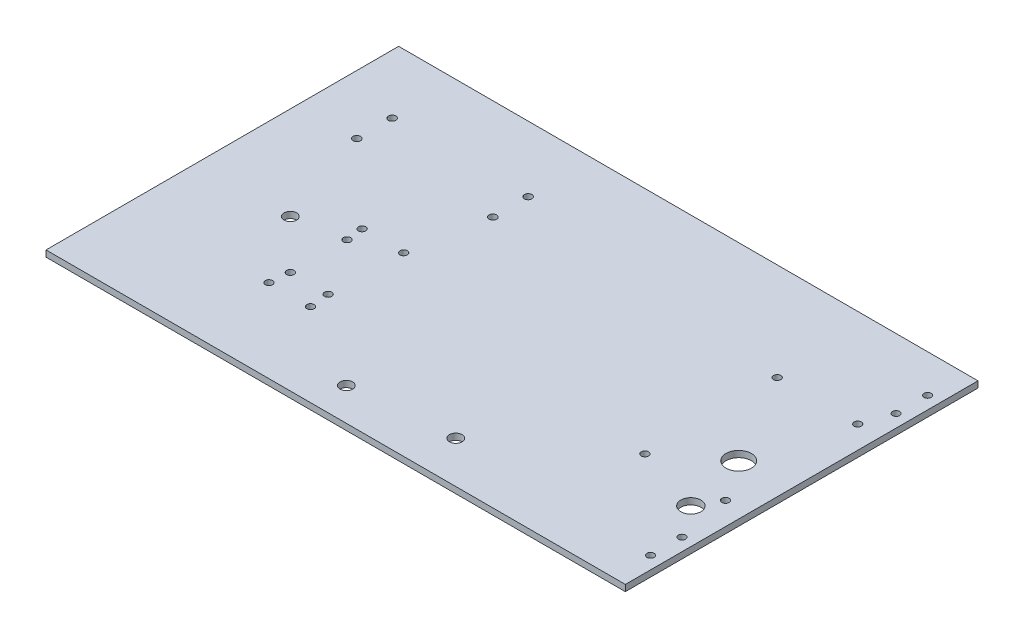
ISO-10303-21;
HEADER;
FILE_DESCRIPTION(('STEP AP214'),'2;1');
FILE_NAME('part.step','',(''),(''),'','','');
FILE_SCHEMA(('AUTOMOTIVE_DESIGN { 1 0 10303 214 1 1 1 1 }'));
ENDSEC;
DATA;
#1=APPLICATION_CONTEXT('core data for automotive mechanical design processes');
#2=APPLICATION_PROTOCOL_DEFINITION('international standard','automotive_design',2000,#1);
#3=PRODUCT_CONTEXT('',#1,'mechanical');
#4=PRODUCT('Part','Part','',(#3));
#5=PRODUCT_RELATED_PRODUCT_CATEGORY('part','',(#4));
#6=PRODUCT_DEFINITION_FORMATION('','',#4);
#7=PRODUCT_DEFINITION_CONTEXT('part definition',#1,'design');
#8=PRODUCT_DEFINITION('design','',#6,#7);
#9=PRODUCT_DEFINITION_SHAPE('','',#8);
#10=(LENGTH_UNIT() NAMED_UNIT(*) SI_UNIT(.MILLI.,.METRE.));
#11=(NAMED_UNIT(*) PLANE_ANGLE_UNIT() SI_UNIT($,.RADIAN.));
#12=(NAMED_UNIT(*) SI_UNIT($,.STERADIAN.) SOLID_ANGLE_UNIT());
#13=UNCERTAINTY_MEASURE_WITH_UNIT(LENGTH_MEASURE(1.E-05),#10,'distance_accuracy_value','');
#14=(GEOMETRIC_REPRESENTATION_CONTEXT(3) GLOBAL_UNCERTAINTY_ASSIGNED_CONTEXT((#13)) GLOBAL_UNIT_ASSIGNED_CONTEXT((#10,
#11,#12)) REPRESENTATION_CONTEXT('',''));
#15=CARTESIAN_POINT('',(0.,0.,0.));
#16=DIRECTION('',(0.,0.,1.));
#17=DIRECTION('',(1.,0.,0.));
#18=AXIS2_PLACEMENT_3D('',#15,#16,#17);
#19=CARTESIAN_POINT('',(0.,3.175,0.));
#20=DIRECTION('',(0.,1.,0.));
#21=DIRECTION('',(0.,0.,1.));
#22=AXIS2_PLACEMENT_3D('',#19,#20,#21);
#23=PLANE('',#22);
#24=CARTESIAN_POINT('',(-87.3125,3.175,37.1475));
#25=DIRECTION('',(0.,1.,0.));
#26=DIRECTION('',(0.,0.,1.));
#27=AXIS2_PLACEMENT_3D('',#24,#25,#26);
#28=CIRCLE('',#27,1.8415);
#29=CARTESIAN_POINT('',(-87.3125,3.175,38.989));
#30=VERTEX_POINT('',#29);
#31=EDGE_CURVE('E207',#30,#30,#28,.T.);
#32=ORIENTED_EDGE('',*,*,#31,.F.);
#33=EDGE_LOOP('',(#32));
#34=FACE_BOUND('',#33,.T.);
#35=CARTESIAN_POINT('',(-88.2649999999999,3.175,46.99));
#36=DIRECTION('',(0.,1.,0.));
#37=DIRECTION('',(0.,0.,1.));
#38=AXIS2_PLACEMENT_3D('',#35,#36,#37);
#39=CIRCLE('',#38,1.84149999999999);
#40=CARTESIAN_POINT('',(-88.2649999999999,3.175,48.8315));
#41=VERTEX_POINT('',#40);
#42=EDGE_CURVE('E218',#41,#41,#39,.T.);
#43=ORIENTED_EDGE('',*,*,#42,.F.);
#44=EDGE_LOOP('',(#43));
#45=FACE_BOUND('',#44,.T.);
#46=CARTESIAN_POINT('',(-68.2625,3.175,37.1475));
#47=DIRECTION('',(0.,1.,0.));
#48=DIRECTION('',(0.,0.,1.));
#49=AXIS2_PLACEMENT_3D('',#46,#47,#48);
#50=CIRCLE('',#49,1.84150000000001);
#51=CARTESIAN_POINT('',(-68.2625,3.175,38.989));
#52=VERTEX_POINT('',#51);
#53=EDGE_CURVE('E219',#52,#52,#50,.T.);
#54=ORIENTED_EDGE('',*,*,#53,.F.);
#55=EDGE_LOOP('',(#54));
#56=FACE_BOUND('',#55,.T.);
#57=CARTESIAN_POINT('',(-87.3125,3.175,8.57250000000002));
#58=DIRECTION('',(0.,1.,0.));
#59=DIRECTION('',(0.,0.,1.));
#60=AXIS2_PLACEMENT_3D('',#57,#58,#59);
#61=CIRCLE('',#60,1.84150000000001);
#62=CARTESIAN_POINT('',(-87.3125,3.175,10.414));
#63=VERTEX_POINT('',#62);
#64=EDGE_CURVE('E230',#63,#63,#61,.T.);
#65=ORIENTED_EDGE('',*,*,#64,.F.);
#66=EDGE_LOOP('',(#65));
#67=FACE_BOUND('',#66,.T.);
#68=CARTESIAN_POINT('',(81.2800000000002,3.175,-39.6875));
#69=DIRECTION('',(0.,1.,0.));
#70=DIRECTION('',(0.,0.,1.));
#71=AXIS2_PLACEMENT_3D('',#68,#69,#70);
#72=CIRCLE('',#71,1.84150000000004);
#73=CARTESIAN_POINT('',(81.2800000000002,3.175,-37.8459999999999));
#74=VERTEX_POINT('',#73);
#75=EDGE_CURVE('E188',#74,#74,#72,.T.);
#76=ORIENTED_EDGE('',*,*,#75,.F.);
#77=EDGE_LOOP('',(#76));
#78=FACE_BOUND('',#77,.T.);
#79=CARTESIAN_POINT('',(81.2800000000001,3.175,26.9875));
#80=DIRECTION('',(0.,1.,0.));
#81=DIRECTION('',(0.,0.,1.));
#82=AXIS2_PLACEMENT_3D('',#79,#80,#81);
#83=CIRCLE('',#82,1.84149999999996);
#84=CARTESIAN_POINT('',(81.2800000000001,3.175,28.829));
#85=VERTEX_POINT('',#84);
#86=EDGE_CURVE('E194',#85,#85,#83,.T.);
#87=ORIENTED_EDGE('',*,*,#86,.F.);
#88=EDGE_LOOP('',(#87));
#89=FACE_BOUND('',#88,.T.);
#90=CARTESIAN_POINT('',(121.92,3.175,26.9875));
#91=DIRECTION('',(0.,1.,0.));
#92=DIRECTION('',(0.,0.,1.));
#93=AXIS2_PLACEMENT_3D('',#90,#91,#92);
#94=CIRCLE('',#93,1.8415);
#95=CARTESIAN_POINT('',(121.92,3.175,28.829));
#96=VERTEX_POINT('',#95);
#97=EDGE_CURVE('E195',#96,#96,#94,.T.);
#98=ORIENTED_EDGE('',*,*,#97,.F.);
#99=EDGE_LOOP('',(#98));
#100=FACE_BOUND('',#99,.T.);
#101=CARTESIAN_POINT('',(-67.3099999999999,3.175,46.99));
#102=DIRECTION('',(0.,1.,0.));
#103=DIRECTION('',(0.,0.,1.));
#104=AXIS2_PLACEMENT_3D('',#101,#102,#103);
#105=CIRCLE('',#104,1.8415);
#106=CARTESIAN_POINT('',(-67.3099999999999,3.175,48.8315));
#107=VERTEX_POINT('',#106);
#108=EDGE_CURVE('E206',#107,#107,#105,.T.);
#109=ORIENTED_EDGE('',*,*,#108,.F.);
#110=EDGE_LOOP('',(#109));
#111=FACE_BOUND('',#110,.T.);
#112=CARTESIAN_POINT('',(-88.2649999999999,3.175,0.));
#113=DIRECTION('',(0.,1.,0.));
#114=DIRECTION('',(0.,0.,1.));
#115=AXIS2_PLACEMENT_3D('',#112,#113,#114);
#116=CIRCLE('',#115,1.8415);
#117=CARTESIAN_POINT('',(-88.2649999999999,3.175,1.84150000000001));
#118=VERTEX_POINT('',#117);
#119=EDGE_CURVE('E231',#118,#118,#116,.T.);
#120=ORIENTED_EDGE('',*,*,#119,.F.);
#121=EDGE_LOOP('',(#120));
#122=FACE_BOUND('',#121,.T.);
#123=CARTESIAN_POINT('',(-67.3099999999999,3.175,0.));
#124=DIRECTION('',(0.,1.,0.));
#125=DIRECTION('',(0.,0.,1.));
#126=AXIS2_PLACEMENT_3D('',#123,#124,#125);
#127=CIRCLE('',#126,1.8415);
#128=CARTESIAN_POINT('',(-67.3099999999999,3.175,1.84150000000001));
#129=VERTEX_POINT('',#128);
#130=EDGE_CURVE('E242',#129,#129,#127,.T.);
#131=ORIENTED_EDGE('',*,*,#130,.F.);
#132=EDGE_LOOP('',(#131));
#133=FACE_BOUND('',#132,.T.);
#134=CARTESIAN_POINT('',(121.92,3.175,-39.6875));
#135=DIRECTION('',(0.,1.,0.));
#136=DIRECTION('',(0.,0.,1.));
#137=AXIS2_PLACEMENT_3D('',#134,#135,#136);
#138=CIRCLE('',#137,1.8415);
#139=CARTESIAN_POINT('',(121.92,3.175,-37.846));
#140=VERTEX_POINT('',#139);
#141=EDGE_CURVE('E185',#140,#140,#138,.T.);
#142=ORIENTED_EDGE('',*,*,#141,.F.);
#143=EDGE_LOOP('',(#142));
#144=FACE_BOUND('',#143,.T.);
#145=CARTESIAN_POINT('',(127.,3.175,69.85));
#146=DIRECTION('',(0.,-1.,0.));
#147=DIRECTION('',(0.,0.,-1.));
#148=AXIS2_PLACEMENT_3D('',#145,#146,#147);
#149=CIRCLE('',#148,1.80340000000001);
#150=CARTESIAN_POINT('',(127.,3.175,68.0466));
#151=VERTEX_POINT('',#150);
#152=EDGE_CURVE('E158',#151,#151,#149,.T.);
#153=ORIENTED_EDGE('',*,*,#152,.T.);
#154=EDGE_LOOP('',(#153));
#155=FACE_BOUND('',#154,.T.);
#156=CARTESIAN_POINT('',(127.,3.175,53.975));
#157=DIRECTION('',(0.,-1.,0.));
#158=DIRECTION('',(0.,0.,-1.));
#159=AXIS2_PLACEMENT_3D('',#156,#157,#158);
#160=CIRCLE('',#159,1.80340000000001);
#161=CARTESIAN_POINT('',(127.,3.175,52.1716));
#162=VERTEX_POINT('',#161);
#163=EDGE_CURVE('E174',#162,#162,#160,.T.);
#164=ORIENTED_EDGE('',*,*,#163,.T.);
#165=EDGE_LOOP('',(#164));
#166=FACE_BOUND('',#165,.T.);
#167=CARTESIAN_POINT('',(127.,3.175,-53.975));
#168=DIRECTION('',(0.,-1.,0.));
#169=DIRECTION('',(0.,0.,-1.));
#170=AXIS2_PLACEMENT_3D('',#167,#168,#169);
#171=CIRCLE('',#170,1.80340000000001);
#172=CARTESIAN_POINT('',(127.,3.175,-55.7784));
#173=VERTEX_POINT('',#172);
#174=EDGE_CURVE('E168',#173,#173,#171,.T.);
#175=ORIENTED_EDGE('',*,*,#174,.T.);
#176=EDGE_LOOP('',(#175));
#177=FACE_BOUND('',#176,.T.);
#178=CARTESIAN_POINT('',(127.,3.175,-69.85));
#179=DIRECTION('',(0.,-1.,0.));
#180=DIRECTION('',(0.,0.,-1.));
#181=AXIS2_PLACEMENT_3D('',#178,#179,#180);
#182=CIRCLE('',#181,1.80340000000001);
#183=CARTESIAN_POINT('',(127.,3.175,-71.6534));
#184=VERTEX_POINT('',#183);
#185=EDGE_CURVE('E161',#184,#184,#182,.T.);
#186=ORIENTED_EDGE('',*,*,#185,.T.);
#187=EDGE_LOOP('',(#186));
#188=FACE_BOUND('',#187,.T.);
#189=CARTESIAN_POINT('',(115.57,3.175,38.1));
#190=DIRECTION('',(0.,1.,0.));
#191=DIRECTION('',(0.,0.,1.));
#192=AXIS2_PLACEMENT_3D('',#189,#190,#191);
#193=CIRCLE('',#192,5.08000000000001);
#194=CARTESIAN_POINT('',(115.57,3.175,43.18));
#195=VERTEX_POINT('',#194);
#196=EDGE_CURVE('E155',#195,#195,#193,.T.);
#197=ORIENTED_EDGE('',*,*,#196,.F.);
#198=EDGE_LOOP('',(#197));
#199=FACE_BOUND('',#198,.T.);
#200=DIRECTION('',(0.,0.,1.));
#201=VECTOR('',#200,1.);
#202=CARTESIAN_POINT('',(133.35,3.175,-88.9));
#203=LINE('',#202,#201);
#204=CARTESIAN_POINT('',(133.35,3.175,-88.9));
#205=VERTEX_POINT('',#204);
#206=CARTESIAN_POINT('',(133.35,3.175,88.9));
#207=VERTEX_POINT('',#206);
#208=EDGE_CURVE('E52',#205,#207,#203,.T.);
#209=ORIENTED_EDGE('',*,*,#208,.F.);
#210=DIRECTION('',(-1.,0.,0.));
#211=VECTOR('',#210,1.);
#212=CARTESIAN_POINT('',(-158.75,3.175,-88.9));
#213=LINE('',#212,#211);
#214=CARTESIAN_POINT('',(-158.75,3.175,-88.9));
#215=VERTEX_POINT('',#214);
#216=EDGE_CURVE('E93',#205,#215,#213,.T.);
#217=ORIENTED_EDGE('',*,*,#216,.T.);
#218=DIRECTION('',(0.,0.,1.));
#219=VECTOR('',#218,1.);
#220=CARTESIAN_POINT('',(-158.75,3.175,-88.9));
#221=LINE('',#220,#219);
#222=CARTESIAN_POINT('',(-158.75,3.175,88.9));
#223=VERTEX_POINT('',#222);
#224=EDGE_CURVE('E61',#215,#223,#221,.T.);
#225=ORIENTED_EDGE('',*,*,#224,.T.);
#226=DIRECTION('',(1.,0.,0.));
#227=VECTOR('',#226,1.);
#228=CARTESIAN_POINT('',(-158.75,3.175,88.9));
#229=LINE('',#228,#227);
#230=EDGE_CURVE('E87',#223,#207,#229,.T.);
#231=ORIENTED_EDGE('',*,*,#230,.T.);
#232=EDGE_LOOP('',(#209,#217,#225,#231));
#233=FACE_BOUND('',#232,.T.);
#234=CARTESIAN_POINT('',(-23.829539608584,3.175,72.39));
#235=DIRECTION('',(0.,-1.,0.));
#236=DIRECTION('',(0.,0.,-1.));
#237=AXIS2_PLACEMENT_3D('',#234,#235,#236);
#238=CIRCLE('',#237,3.175);
#239=CARTESIAN_POINT('',(-23.829539608584,3.175,69.215));
#240=VERTEX_POINT('',#239);
#241=EDGE_CURVE('E134',#240,#240,#238,.T.);
#242=ORIENTED_EDGE('',*,*,#241,.T.);
#243=EDGE_LOOP('',(#242));
#244=FACE_BOUND('',#243,.T.);
#245=CARTESIAN_POINT('',(26.764302072,3.175,67.818));
#246=DIRECTION('',(0.,-1.,0.));
#247=DIRECTION('',(0.,0.,-1.));
#248=AXIS2_PLACEMENT_3D('',#245,#246,#247);
#249=CIRCLE('',#248,3.175);
#250=CARTESIAN_POINT('',(26.764302072,3.175,64.643));
#251=VERTEX_POINT('',#250);
#252=EDGE_CURVE('E140',#251,#251,#249,.T.);
#253=ORIENTED_EDGE('',*,*,#252,.T.);
#254=EDGE_LOOP('',(#253));
#255=FACE_BOUND('',#254,.T.);
#256=CARTESIAN_POINT('',(-129.032,3.175,-38.1));
#257=DIRECTION('',(0.,1.,0.));
#258=DIRECTION('',(0.,0.,1.));
#259=AXIS2_PLACEMENT_3D('',#256,#257,#258);
#260=CIRCLE('',#259,1.90499999999999);
#261=CARTESIAN_POINT('',(-129.032,3.175,-36.195));
#262=VERTEX_POINT('',#261);
#263=EDGE_CURVE('E122',#262,#262,#260,.T.);
#264=ORIENTED_EDGE('',*,*,#263,.F.);
#265=EDGE_LOOP('',(#264));
#266=FACE_BOUND('',#265,.T.);
#267=CARTESIAN_POINT('',(-129.032,3.175,-55.88));
#268=DIRECTION('',(0.,1.,0.));
#269=DIRECTION('',(0.,0.,1.));
#270=AXIS2_PLACEMENT_3D('',#267,#268,#269);
#271=CIRCLE('',#270,1.90499999999999);
#272=CARTESIAN_POINT('',(-129.032,3.175,-53.975));
#273=VERTEX_POINT('',#272);
#274=EDGE_CURVE('E110',#273,#273,#271,.T.);
#275=ORIENTED_EDGE('',*,*,#274,.F.);
#276=EDGE_LOOP('',(#275));
#277=FACE_BOUND('',#276,.T.);
#278=CARTESIAN_POINT('',(-111.76,3.175,12.7));
#279=DIRECTION('',(0.,1.,0.));
#280=DIRECTION('',(0.,0.,1.));
#281=AXIS2_PLACEMENT_3D('',#278,#279,#280);
#282=CIRCLE('',#281,3.175);
#283=CARTESIAN_POINT('',(-111.76,3.175,15.875));
#284=VERTEX_POINT('',#283);
#285=EDGE_CURVE('E98',#284,#284,#282,.T.);
#286=ORIENTED_EDGE('',*,*,#285,.F.);
#287=EDGE_LOOP('',(#286));
#288=FACE_BOUND('',#287,.T.);
#289=CARTESIAN_POINT('',(107.95,3.175,6.35000000000002));
#290=DIRECTION('',(0.,1.,0.));
#291=DIRECTION('',(0.,0.,1.));
#292=AXIS2_PLACEMENT_3D('',#289,#290,#291);
#293=CIRCLE('',#292,6.4135);
#294=CARTESIAN_POINT('',(107.95,3.175,12.7635));
#295=VERTEX_POINT('',#294);
#296=EDGE_CURVE('E104',#295,#295,#293,.T.);
#297=ORIENTED_EDGE('',*,*,#296,.F.);
#298=EDGE_LOOP('',(#297));
#299=FACE_BOUND('',#298,.T.);
#300=CARTESIAN_POINT('',(-60.452,3.175,-55.88));
#301=DIRECTION('',(0.,1.,0.));
#302=DIRECTION('',(0.,0.,1.));
#303=AXIS2_PLACEMENT_3D('',#300,#301,#302);
#304=CIRCLE('',#303,1.90500000000001);
#305=CARTESIAN_POINT('',(-60.452,3.175,-53.975));
#306=VERTEX_POINT('',#305);
#307=EDGE_CURVE('E116',#306,#306,#304,.T.);
#308=ORIENTED_EDGE('',*,*,#307,.F.);
#309=EDGE_LOOP('',(#308));
#310=FACE_BOUND('',#309,.T.);
#311=CARTESIAN_POINT('',(-60.452,3.175,-38.1));
#312=DIRECTION('',(0.,1.,0.));
#313=DIRECTION('',(0.,0.,1.));
#314=AXIS2_PLACEMENT_3D('',#311,#312,#313);
#315=CIRCLE('',#314,1.90500000000001);
#316=CARTESIAN_POINT('',(-60.452,3.175,-36.195));
#317=VERTEX_POINT('',#316);
#318=EDGE_CURVE('E128',#317,#317,#315,.T.);
#319=ORIENTED_EDGE('',*,*,#318,.F.);
#320=EDGE_LOOP('',(#319));
#321=FACE_BOUND('',#320,.T.);
#322=ADVANCED_FACE('F37',(#34,#45,#56,#67,#78,#89,#100,#111,#122,#133,#144,#155,#166,#177,#188,
#199,#233,#244,#255,#266,#277,#288,#299,#310,#321),#23,.T.);
#323=CARTESIAN_POINT('',(0.,0.,0.));
#324=DIRECTION('',(0.,1.,0.));
#325=DIRECTION('',(0.,0.,1.));
#326=AXIS2_PLACEMENT_3D('',#323,#324,#325);
#327=PLANE('',#326);
#328=CARTESIAN_POINT('',(-87.3125,0.,37.1475));
#329=DIRECTION('',(0.,1.,0.));
#330=DIRECTION('',(0.,0.,1.));
#331=AXIS2_PLACEMENT_3D('',#328,#329,#330);
#332=CIRCLE('',#331,1.8415);
#333=CARTESIAN_POINT('',(-87.3125,0.,38.989));
#334=VERTEX_POINT('',#333);
#335=EDGE_CURVE('E222',#334,#334,#332,.T.);
#336=ORIENTED_EDGE('',*,*,#335,.T.);
#337=EDGE_LOOP('',(#336));
#338=FACE_BOUND('',#337,.T.);
#339=CARTESIAN_POINT('',(-88.2649999999999,0.,46.99));
#340=DIRECTION('',(0.,1.,0.));
#341=DIRECTION('',(0.,0.,1.));
#342=AXIS2_PLACEMENT_3D('',#339,#340,#341);
#343=CIRCLE('',#342,1.84149999999999);
#344=CARTESIAN_POINT('',(-88.2649999999999,0.,48.8315));
#345=VERTEX_POINT('',#344);
#346=EDGE_CURVE('E215',#345,#345,#343,.T.);
#347=ORIENTED_EDGE('',*,*,#346,.T.);
#348=EDGE_LOOP('',(#347));
#349=FACE_BOUND('',#348,.T.);
#350=CARTESIAN_POINT('',(-68.2625,0.,37.1475));
#351=DIRECTION('',(0.,1.,0.));
#352=DIRECTION('',(0.,0.,1.));
#353=AXIS2_PLACEMENT_3D('',#350,#351,#352);
#354=CIRCLE('',#353,1.84150000000001);
#355=CARTESIAN_POINT('',(-68.2625,0.,38.989));
#356=VERTEX_POINT('',#355);
#357=EDGE_CURVE('E234',#356,#356,#354,.T.);
#358=ORIENTED_EDGE('',*,*,#357,.T.);
#359=EDGE_LOOP('',(#358));
#360=FACE_BOUND('',#359,.T.);
#361=CARTESIAN_POINT('',(-87.3125,0.,8.57250000000002));
#362=DIRECTION('',(0.,1.,0.));
#363=DIRECTION('',(0.,0.,1.));
#364=AXIS2_PLACEMENT_3D('',#361,#362,#363);
#365=CIRCLE('',#364,1.84150000000001);
#366=CARTESIAN_POINT('',(-87.3125,0.,10.414));
#367=VERTEX_POINT('',#366);
#368=EDGE_CURVE('E227',#367,#367,#365,.T.);
#369=ORIENTED_EDGE('',*,*,#368,.T.);
#370=EDGE_LOOP('',(#369));
#371=FACE_BOUND('',#370,.T.);
#372=CARTESIAN_POINT('',(81.2800000000002,0.,-39.6875));
#373=DIRECTION('',(0.,1.,0.));
#374=DIRECTION('',(0.,0.,1.));
#375=AXIS2_PLACEMENT_3D('',#372,#373,#374);
#376=CIRCLE('',#375,1.84150000000004);
#377=CARTESIAN_POINT('',(81.2800000000002,0.,-37.8459999999999));
#378=VERTEX_POINT('',#377);
#379=EDGE_CURVE('E198',#378,#378,#376,.T.);
#380=ORIENTED_EDGE('',*,*,#379,.T.);
#381=EDGE_LOOP('',(#380));
#382=FACE_BOUND('',#381,.T.);
#383=CARTESIAN_POINT('',(81.2800000000001,0.,26.9875));
#384=DIRECTION('',(0.,1.,0.));
#385=DIRECTION('',(0.,0.,1.));
#386=AXIS2_PLACEMENT_3D('',#383,#384,#385);
#387=CIRCLE('',#386,1.84149999999996);
#388=CARTESIAN_POINT('',(81.2800000000001,0.,28.829));
#389=VERTEX_POINT('',#388);
#390=EDGE_CURVE('E191',#389,#389,#387,.T.);
#391=ORIENTED_EDGE('',*,*,#390,.T.);
#392=EDGE_LOOP('',(#391));
#393=FACE_BOUND('',#392,.T.);
#394=CARTESIAN_POINT('',(121.92,0.,26.9875));
#395=DIRECTION('',(0.,1.,0.));
#396=DIRECTION('',(0.,0.,1.));
#397=AXIS2_PLACEMENT_3D('',#394,#395,#396);
#398=CIRCLE('',#397,1.8415);
#399=CARTESIAN_POINT('',(121.92,0.,28.829));
#400=VERTEX_POINT('',#399);
#401=EDGE_CURVE('E210',#400,#400,#398,.T.);
#402=ORIENTED_EDGE('',*,*,#401,.T.);
#403=EDGE_LOOP('',(#402));
#404=FACE_BOUND('',#403,.T.);
#405=CARTESIAN_POINT('',(-67.3099999999999,0.,46.99));
#406=DIRECTION('',(0.,1.,0.));
#407=DIRECTION('',(0.,0.,1.));
#408=AXIS2_PLACEMENT_3D('',#405,#406,#407);
#409=CIRCLE('',#408,1.8415);
#410=CARTESIAN_POINT('',(-67.3099999999999,0.,48.8315));
#411=VERTEX_POINT('',#410);
#412=EDGE_CURVE('E203',#411,#411,#409,.T.);
#413=ORIENTED_EDGE('',*,*,#412,.T.);
#414=EDGE_LOOP('',(#413));
#415=FACE_BOUND('',#414,.T.);
#416=CARTESIAN_POINT('',(-88.2649999999999,0.,0.));
#417=DIRECTION('',(0.,1.,0.));
#418=DIRECTION('',(0.,0.,1.));
#419=AXIS2_PLACEMENT_3D('',#416,#417,#418);
#420=CIRCLE('',#419,1.8415);
#421=CARTESIAN_POINT('',(-88.2649999999999,0.,1.84150000000001));
#422=VERTEX_POINT('',#421);
#423=EDGE_CURVE('E245',#422,#422,#420,.T.);
#424=ORIENTED_EDGE('',*,*,#423,.T.);
#425=EDGE_LOOP('',(#424));
#426=FACE_BOUND('',#425,.T.);
#427=CARTESIAN_POINT('',(-67.3099999999999,0.,0.));
#428=DIRECTION('',(0.,1.,0.));
#429=DIRECTION('',(0.,0.,1.));
#430=AXIS2_PLACEMENT_3D('',#427,#428,#429);
#431=CIRCLE('',#430,1.8415);
#432=CARTESIAN_POINT('',(-67.3099999999999,0.,1.84150000000001));
#433=VERTEX_POINT('',#432);
#434=EDGE_CURVE('E239',#433,#433,#431,.T.);
#435=ORIENTED_EDGE('',*,*,#434,.T.);
#436=EDGE_LOOP('',(#435));
#437=FACE_BOUND('',#436,.T.);
#438=CARTESIAN_POINT('',(121.92,0.,-39.6875));
#439=DIRECTION('',(0.,1.,0.));
#440=DIRECTION('',(0.,0.,1.));
#441=AXIS2_PLACEMENT_3D('',#438,#439,#440);
#442=CIRCLE('',#441,1.8415);
#443=CARTESIAN_POINT('',(121.92,0.,-37.846));
#444=VERTEX_POINT('',#443);
#445=EDGE_CURVE('E165',#444,#444,#442,.T.);
#446=ORIENTED_EDGE('',*,*,#445,.T.);
#447=EDGE_LOOP('',(#446));
#448=FACE_BOUND('',#447,.T.);
#449=CARTESIAN_POINT('',(127.,0.,69.85));
#450=DIRECTION('',(0.,-1.,0.));
#451=DIRECTION('',(0.,0.,-1.));
#452=AXIS2_PLACEMENT_3D('',#449,#450,#451);
#453=CIRCLE('',#452,1.80340000000001);
#454=CARTESIAN_POINT('',(127.,0.,68.0466));
#455=VERTEX_POINT('',#454);
#456=EDGE_CURVE('E180',#455,#455,#453,.T.);
#457=ORIENTED_EDGE('',*,*,#456,.F.);
#458=EDGE_LOOP('',(#457));
#459=FACE_BOUND('',#458,.T.);
#460=CARTESIAN_POINT('',(127.,0.,53.975));
#461=DIRECTION('',(0.,-1.,0.));
#462=DIRECTION('',(0.,0.,-1.));
#463=AXIS2_PLACEMENT_3D('',#460,#461,#462);
#464=CIRCLE('',#463,1.80340000000001);
#465=CARTESIAN_POINT('',(127.,0.,52.1716));
#466=VERTEX_POINT('',#465);
#467=EDGE_CURVE('E177',#466,#466,#464,.T.);
#468=ORIENTED_EDGE('',*,*,#467,.F.);
#469=EDGE_LOOP('',(#468));
#470=FACE_BOUND('',#469,.T.);
#471=CARTESIAN_POINT('',(127.,0.,-53.975));
#472=DIRECTION('',(0.,-1.,0.));
#473=DIRECTION('',(0.,0.,-1.));
#474=AXIS2_PLACEMENT_3D('',#471,#472,#473);
#475=CIRCLE('',#474,1.80340000000001);
#476=CARTESIAN_POINT('',(127.,0.,-55.7784));
#477=VERTEX_POINT('',#476);
#478=EDGE_CURVE('E171',#477,#477,#475,.T.);
#479=ORIENTED_EDGE('',*,*,#478,.F.);
#480=EDGE_LOOP('',(#479));
#481=FACE_BOUND('',#480,.T.);
#482=CARTESIAN_POINT('',(127.,0.,-69.85));
#483=DIRECTION('',(0.,-1.,0.));
#484=DIRECTION('',(0.,0.,-1.));
#485=AXIS2_PLACEMENT_3D('',#482,#483,#484);
#486=CIRCLE('',#485,1.80340000000001);
#487=CARTESIAN_POINT('',(127.,0.,-71.6534));
#488=VERTEX_POINT('',#487);
#489=EDGE_CURVE('E164',#488,#488,#486,.T.);
#490=ORIENTED_EDGE('',*,*,#489,.F.);
#491=EDGE_LOOP('',(#490));
#492=FACE_BOUND('',#491,.T.);
#493=CARTESIAN_POINT('',(115.57,0.,38.1));
#494=DIRECTION('',(0.,1.,0.));
#495=DIRECTION('',(0.,0.,1.));
#496=AXIS2_PLACEMENT_3D('',#493,#494,#495);
#497=CIRCLE('',#496,5.08000000000001);
#498=CARTESIAN_POINT('',(115.57,0.,43.18));
#499=VERTEX_POINT('',#498);
#500=EDGE_CURVE('E153',#499,#499,#497,.T.);
#501=ORIENTED_EDGE('',*,*,#500,.T.);
#502=EDGE_LOOP('',(#501));
#503=FACE_BOUND('',#502,.T.);
#504=CARTESIAN_POINT('',(-23.829539608584,0.,72.39));
#505=DIRECTION('',(0.,-1.,0.));
#506=DIRECTION('',(0.,0.,-1.));
#507=AXIS2_PLACEMENT_3D('',#504,#505,#506);
#508=CIRCLE('',#507,3.175);
#509=CARTESIAN_POINT('',(-23.829539608584,0.,69.215));
#510=VERTEX_POINT('',#509);
#511=EDGE_CURVE('E144',#510,#510,#508,.T.);
#512=ORIENTED_EDGE('',*,*,#511,.F.);
#513=EDGE_LOOP('',(#512));
#514=FACE_BOUND('',#513,.T.);
#515=CARTESIAN_POINT('',(26.764302072,0.,67.818));
#516=DIRECTION('',(0.,-1.,0.));
#517=DIRECTION('',(0.,0.,-1.));
#518=AXIS2_PLACEMENT_3D('',#515,#516,#517);
#519=CIRCLE('',#518,3.175);
#520=CARTESIAN_POINT('',(26.764302072,0.,64.643));
#521=VERTEX_POINT('',#520);
#522=EDGE_CURVE('E137',#521,#521,#519,.T.);
#523=ORIENTED_EDGE('',*,*,#522,.F.);
#524=EDGE_LOOP('',(#523));
#525=FACE_BOUND('',#524,.T.);
#526=DIRECTION('',(-1.,0.,0.));
#527=VECTOR('',#526,1.);
#528=CARTESIAN_POINT('',(-158.75,0.,-88.9));
#529=LINE('',#528,#527);
#530=CARTESIAN_POINT('',(133.35,0.,-88.9));
#531=VERTEX_POINT('',#530);
#532=CARTESIAN_POINT('',(-158.75,0.,-88.9));
#533=VERTEX_POINT('',#532);
#534=EDGE_CURVE('E82',#531,#533,#529,.T.);
#535=ORIENTED_EDGE('',*,*,#534,.F.);
#536=DIRECTION('',(0.,0.,1.));
#537=VECTOR('',#536,1.);
#538=CARTESIAN_POINT('',(133.35,0.,-88.9));
#539=LINE('',#538,#537);
#540=CARTESIAN_POINT('',(133.35,0.,88.9));
#541=VERTEX_POINT('',#540);
#542=EDGE_CURVE('E92',#531,#541,#539,.T.);
#543=ORIENTED_EDGE('',*,*,#542,.T.);
#544=DIRECTION('',(1.,0.,0.));
#545=VECTOR('',#544,1.);
#546=CARTESIAN_POINT('',(-158.75,0.,88.9));
#547=LINE('',#546,#545);
#548=CARTESIAN_POINT('',(-158.75,0.,88.9));
#549=VERTEX_POINT('',#548);
#550=EDGE_CURVE('E81',#549,#541,#547,.T.);
#551=ORIENTED_EDGE('',*,*,#550,.F.);
#552=DIRECTION('',(0.,0.,1.));
#553=VECTOR('',#552,1.);
#554=CARTESIAN_POINT('',(-158.75,0.,-88.9));
#555=LINE('',#554,#553);
#556=EDGE_CURVE('E73',#533,#549,#555,.T.);
#557=ORIENTED_EDGE('',*,*,#556,.F.);
#558=EDGE_LOOP('',(#535,#543,#551,#557));
#559=FACE_BOUND('',#558,.T.);
#560=CARTESIAN_POINT('',(-111.76,0.,12.7));
#561=DIRECTION('',(0.,1.,0.));
#562=DIRECTION('',(0.,0.,1.));
#563=AXIS2_PLACEMENT_3D('',#560,#561,#562);
#564=CIRCLE('',#563,3.175);
#565=CARTESIAN_POINT('',(-111.76,0.,15.875));
#566=VERTEX_POINT('',#565);
#567=EDGE_CURVE('E101',#566,#566,#564,.T.);
#568=ORIENTED_EDGE('',*,*,#567,.T.);
#569=EDGE_LOOP('',(#568));
#570=FACE_BOUND('',#569,.T.);
#571=CARTESIAN_POINT('',(107.95,0.,6.35000000000002));
#572=DIRECTION('',(0.,1.,0.));
#573=DIRECTION('',(0.,0.,1.));
#574=AXIS2_PLACEMENT_3D('',#571,#572,#573);
#575=CIRCLE('',#574,6.4135);
#576=CARTESIAN_POINT('',(107.95,0.,12.7635));
#577=VERTEX_POINT('',#576);
#578=EDGE_CURVE('E107',#577,#577,#575,.T.);
#579=ORIENTED_EDGE('',*,*,#578,.T.);
#580=EDGE_LOOP('',(#579));
#581=FACE_BOUND('',#580,.T.);
#582=CARTESIAN_POINT('',(-129.032,0.,-55.88));
#583=DIRECTION('',(0.,1.,0.));
#584=DIRECTION('',(0.,0.,1.));
#585=AXIS2_PLACEMENT_3D('',#582,#583,#584);
#586=CIRCLE('',#585,1.90499999999999);
#587=CARTESIAN_POINT('',(-129.032,0.,-53.975));
#588=VERTEX_POINT('',#587);
#589=EDGE_CURVE('E113',#588,#588,#586,.T.);
#590=ORIENTED_EDGE('',*,*,#589,.T.);
#591=EDGE_LOOP('',(#590));
#592=FACE_BOUND('',#591,.T.);
#593=CARTESIAN_POINT('',(-60.452,0.,-55.88));
#594=DIRECTION('',(0.,1.,0.));
#595=DIRECTION('',(0.,0.,1.));
#596=AXIS2_PLACEMENT_3D('',#593,#594,#595);
#597=CIRCLE('',#596,1.90500000000001);
#598=CARTESIAN_POINT('',(-60.452,0.,-53.975));
#599=VERTEX_POINT('',#598);
#600=EDGE_CURVE('E119',#599,#599,#597,.T.);
#601=ORIENTED_EDGE('',*,*,#600,.T.);
#602=EDGE_LOOP('',(#601));
#603=FACE_BOUND('',#602,.T.);
#604=CARTESIAN_POINT('',(-129.032,0.,-38.1));
#605=DIRECTION('',(0.,1.,0.));
#606=DIRECTION('',(0.,0.,1.));
#607=AXIS2_PLACEMENT_3D('',#604,#605,#606);
#608=CIRCLE('',#607,1.90499999999999);
#609=CARTESIAN_POINT('',(-129.032,0.,-36.195));
#610=VERTEX_POINT('',#609);
#611=EDGE_CURVE('E125',#610,#610,#608,.T.);
#612=ORIENTED_EDGE('',*,*,#611,.T.);
#613=EDGE_LOOP('',(#612));
#614=FACE_BOUND('',#613,.T.);
#615=CARTESIAN_POINT('',(-60.452,0.,-38.1));
#616=DIRECTION('',(0.,1.,0.));
#617=DIRECTION('',(0.,0.,1.));
#618=AXIS2_PLACEMENT_3D('',#615,#616,#617);
#619=CIRCLE('',#618,1.90500000000001);
#620=CARTESIAN_POINT('',(-60.452,0.,-36.195));
#621=VERTEX_POINT('',#620);
#622=EDGE_CURVE('E131',#621,#621,#619,.T.);
#623=ORIENTED_EDGE('',*,*,#622,.T.);
#624=EDGE_LOOP('',(#623));
#625=FACE_BOUND('',#624,.T.);
#626=ADVANCED_FACE('F89',(#338,#349,#360,#371,#382,#393,#404,#415,#426,#437,#448,#459,#470,#481,
#492,#503,#514,#525,#559,#570,#581,#592,#603,#614,#625),#327,.F.);
#627=CARTESIAN_POINT('',(-158.75,3.175,-88.9));
#628=DIRECTION('',(0.,0.,1.));
#629=DIRECTION('',(1.,0.,0.));
#630=AXIS2_PLACEMENT_3D('',#627,#628,#629);
#631=PLANE('',#630);
#632=ORIENTED_EDGE('',*,*,#216,.F.);
#633=DIRECTION('',(0.,1.,0.));
#634=VECTOR('',#633,1.);
#635=CARTESIAN_POINT('',(133.35,0.,-88.9));
#636=LINE('',#635,#634);
#637=EDGE_CURVE('E149',#531,#205,#636,.T.);
#638=ORIENTED_EDGE('',*,*,#637,.F.);
#639=ORIENTED_EDGE('',*,*,#534,.T.);
#640=DIRECTION('',(0.,-1.,0.));
#641=VECTOR('',#640,1.);
#642=CARTESIAN_POINT('',(-158.75,3.175,-88.9));
#643=LINE('',#642,#641);
#644=EDGE_CURVE('E11',#215,#533,#643,.T.);
#645=ORIENTED_EDGE('',*,*,#644,.F.);
#646=EDGE_LOOP('',(#632,#638,#639,#645));
#647=FACE_BOUND('',#646,.T.);
#648=ADVANCED_FACE('F39',(#647),#631,.F.);
#649=CARTESIAN_POINT('',(-158.75,3.175,-88.9));
#650=DIRECTION('',(1.,0.,0.));
#651=DIRECTION('',(0.,0.,-1.));
#652=AXIS2_PLACEMENT_3D('',#649,#650,#651);
#653=PLANE('',#652);
#654=ORIENTED_EDGE('',*,*,#556,.T.);
#655=DIRECTION('',(0.,-1.,0.));
#656=VECTOR('',#655,1.);
#657=CARTESIAN_POINT('',(-158.75,3.175,88.9));
#658=LINE('',#657,#656);
#659=EDGE_CURVE('E45',#223,#549,#658,.T.);
#660=ORIENTED_EDGE('',*,*,#659,.F.);
#661=ORIENTED_EDGE('',*,*,#224,.F.);
#662=ORIENTED_EDGE('',*,*,#644,.T.);
#663=EDGE_LOOP('',(#654,#660,#661,#662));
#664=FACE_BOUND('',#663,.T.);
#665=ADVANCED_FACE('F75',(#664),#653,.F.);
#666=CARTESIAN_POINT('',(-158.75,3.175,88.9));
#667=DIRECTION('',(0.,0.,-1.));
#668=DIRECTION('',(-1.,0.,0.));
#669=AXIS2_PLACEMENT_3D('',#666,#667,#668);
#670=PLANE('',#669);
#671=ORIENTED_EDGE('',*,*,#550,.T.);
#672=DIRECTION('',(0.,1.,0.));
#673=VECTOR('',#672,1.);
#674=CARTESIAN_POINT('',(133.35,0.,88.9));
#675=LINE('',#674,#673);
#676=EDGE_CURVE('E141',#541,#207,#675,.T.);
#677=ORIENTED_EDGE('',*,*,#676,.T.);
#678=ORIENTED_EDGE('',*,*,#230,.F.);
#679=ORIENTED_EDGE('',*,*,#659,.T.);
#680=EDGE_LOOP('',(#671,#677,#678,#679));
#681=FACE_BOUND('',#680,.T.);
#682=ADVANCED_FACE('F86',(#681),#670,.F.);
#683=CARTESIAN_POINT('',(-111.76,3.175,12.7));
#684=DIRECTION('',(0.,-1.,0.));
#685=DIRECTION('',(0.,0.,-1.));
#686=AXIS2_PLACEMENT_3D('',#683,#684,#685);
#687=CYLINDRICAL_SURFACE('',#686,3.175);
#688=ORIENTED_EDGE('',*,*,#285,.T.);
#689=EDGE_LOOP('',(#688));
#690=FACE_BOUND('',#689,.T.);
#691=ORIENTED_EDGE('',*,*,#567,.F.);
#692=EDGE_LOOP('',(#691));
#693=FACE_BOUND('',#692,.T.);
#694=ADVANCED_FACE('F308',(#690,#693),#687,.F.);
#695=CARTESIAN_POINT('',(107.95,3.175,6.35000000000002));
#696=DIRECTION('',(0.,-1.,0.));
#697=DIRECTION('',(0.,0.,-1.));
#698=AXIS2_PLACEMENT_3D('',#695,#696,#697);
#699=CYLINDRICAL_SURFACE('',#698,6.4135);
#700=ORIENTED_EDGE('',*,*,#296,.T.);
#701=EDGE_LOOP('',(#700));
#702=FACE_BOUND('',#701,.T.);
#703=ORIENTED_EDGE('',*,*,#578,.F.);
#704=EDGE_LOOP('',(#703));
#705=FACE_BOUND('',#704,.T.);
#706=ADVANCED_FACE('F325',(#702,#705),#699,.F.);
#707=CARTESIAN_POINT('',(-129.032,3.175,-55.88));
#708=DIRECTION('',(0.,-1.,0.));
#709=DIRECTION('',(0.,0.,-1.));
#710=AXIS2_PLACEMENT_3D('',#707,#708,#709);
#711=CYLINDRICAL_SURFACE('',#710,1.90499999999999);
#712=ORIENTED_EDGE('',*,*,#274,.T.);
#713=EDGE_LOOP('',(#712));
#714=FACE_BOUND('',#713,.T.);
#715=ORIENTED_EDGE('',*,*,#589,.F.);
#716=EDGE_LOOP('',(#715));
#717=FACE_BOUND('',#716,.T.);
#718=ADVANCED_FACE('F332',(#714,#717),#711,.F.);
#719=CARTESIAN_POINT('',(-60.452,3.175,-55.88));
#720=DIRECTION('',(0.,-1.,0.));
#721=DIRECTION('',(0.,0.,-1.));
#722=AXIS2_PLACEMENT_3D('',#719,#720,#721);
#723=CYLINDRICAL_SURFACE('',#722,1.90500000000001);
#724=ORIENTED_EDGE('',*,*,#307,.T.);
#725=EDGE_LOOP('',(#724));
#726=FACE_BOUND('',#725,.T.);
#727=ORIENTED_EDGE('',*,*,#600,.F.);
#728=EDGE_LOOP('',(#727));
#729=FACE_BOUND('',#728,.T.);
#730=ADVANCED_FACE('F340',(#726,#729),#723,.F.);
#731=CARTESIAN_POINT('',(-129.032,3.175,-38.1));
#732=DIRECTION('',(0.,-1.,0.));
#733=DIRECTION('',(0.,0.,-1.));
#734=AXIS2_PLACEMENT_3D('',#731,#732,#733);
#735=CYLINDRICAL_SURFACE('',#734,1.90499999999999);
#736=ORIENTED_EDGE('',*,*,#263,.T.);
#737=EDGE_LOOP('',(#736));
#738=FACE_BOUND('',#737,.T.);
#739=ORIENTED_EDGE('',*,*,#611,.F.);
#740=EDGE_LOOP('',(#739));
#741=FACE_BOUND('',#740,.T.);
#742=ADVANCED_FACE('F293',(#738,#741),#735,.F.);
#743=CARTESIAN_POINT('',(-60.452,3.175,-38.1));
#744=DIRECTION('',(0.,-1.,0.));
#745=DIRECTION('',(0.,0.,-1.));
#746=AXIS2_PLACEMENT_3D('',#743,#744,#745);
#747=CYLINDRICAL_SURFACE('',#746,1.90500000000001);
#748=ORIENTED_EDGE('',*,*,#318,.T.);
#749=EDGE_LOOP('',(#748));
#750=FACE_BOUND('',#749,.T.);
#751=ORIENTED_EDGE('',*,*,#622,.F.);
#752=EDGE_LOOP('',(#751));
#753=FACE_BOUND('',#752,.T.);
#754=ADVANCED_FACE('F289',(#750,#753),#747,.F.);
#755=CARTESIAN_POINT('',(26.764302072,3.175,67.818));
#756=DIRECTION('',(0.,-1.,0.));
#757=DIRECTION('',(0.,0.,-1.));
#758=AXIS2_PLACEMENT_3D('',#755,#756,#757);
#759=CYLINDRICAL_SURFACE('',#758,3.175);
#760=ORIENTED_EDGE('',*,*,#252,.F.);
#761=EDGE_LOOP('',(#760));
#762=FACE_BOUND('',#761,.T.);
#763=ORIENTED_EDGE('',*,*,#522,.T.);
#764=EDGE_LOOP('',(#763));
#765=FACE_BOUND('',#764,.T.);
#766=ADVANCED_FACE('F292',(#762,#765),#759,.F.);
#767=CARTESIAN_POINT('',(-23.829539608584,3.175,72.39));
#768=DIRECTION('',(0.,-1.,0.));
#769=DIRECTION('',(0.,0.,-1.));
#770=AXIS2_PLACEMENT_3D('',#767,#768,#769);
#771=CYLINDRICAL_SURFACE('',#770,3.175);
#772=ORIENTED_EDGE('',*,*,#241,.F.);
#773=EDGE_LOOP('',(#772));
#774=FACE_BOUND('',#773,.T.);
#775=ORIENTED_EDGE('',*,*,#511,.T.);
#776=EDGE_LOOP('',(#775));
#777=FACE_BOUND('',#776,.T.);
#778=ADVANCED_FACE('F366',(#774,#777),#771,.F.);
#779=CARTESIAN_POINT('',(133.35,0.,-88.9));
#780=DIRECTION('',(-1.,0.,0.));
#781=DIRECTION('',(0.,0.,1.));
#782=AXIS2_PLACEMENT_3D('',#779,#780,#781);
#783=PLANE('',#782);
#784=ORIENTED_EDGE('',*,*,#208,.T.);
#785=ORIENTED_EDGE('',*,*,#676,.F.);
#786=ORIENTED_EDGE('',*,*,#542,.F.);
#787=ORIENTED_EDGE('',*,*,#637,.T.);
#788=EDGE_LOOP('',(#784,#785,#786,#787));
#789=FACE_BOUND('',#788,.T.);
#790=ADVANCED_FACE('F374',(#789),#783,.F.);
#791=CARTESIAN_POINT('',(115.57,0.,38.1));
#792=DIRECTION('',(0.,1.,0.));
#793=DIRECTION('',(0.,0.,1.));
#794=AXIS2_PLACEMENT_3D('',#791,#792,#793);
#795=CYLINDRICAL_SURFACE('',#794,5.08000000000001);
#796=ORIENTED_EDGE('',*,*,#500,.F.);
#797=EDGE_LOOP('',(#796));
#798=FACE_BOUND('',#797,.T.);
#799=ORIENTED_EDGE('',*,*,#196,.T.);
#800=EDGE_LOOP('',(#799));
#801=FACE_BOUND('',#800,.T.);
#802=ADVANCED_FACE('F381',(#798,#801),#795,.F.);
#803=CARTESIAN_POINT('',(127.,3.175,-69.85));
#804=DIRECTION('',(0.,-1.,0.));
#805=DIRECTION('',(0.,0.,-1.));
#806=AXIS2_PLACEMENT_3D('',#803,#804,#805);
#807=CYLINDRICAL_SURFACE('',#806,1.80340000000001);
#808=ORIENTED_EDGE('',*,*,#185,.F.);
#809=EDGE_LOOP('',(#808));
#810=FACE_BOUND('',#809,.T.);
#811=ORIENTED_EDGE('',*,*,#489,.T.);
#812=EDGE_LOOP('',(#811));
#813=FACE_BOUND('',#812,.T.);
#814=ADVANCED_FACE('F388',(#810,#813),#807,.F.);
#815=CARTESIAN_POINT('',(127.,3.175,-53.975));
#816=DIRECTION('',(0.,-1.,0.));
#817=DIRECTION('',(0.,0.,-1.));
#818=AXIS2_PLACEMENT_3D('',#815,#816,#817);
#819=CYLINDRICAL_SURFACE('',#818,1.80340000000001);
#820=ORIENTED_EDGE('',*,*,#174,.F.);
#821=EDGE_LOOP('',(#820));
#822=FACE_BOUND('',#821,.T.);
#823=ORIENTED_EDGE('',*,*,#478,.T.);
#824=EDGE_LOOP('',(#823));
#825=FACE_BOUND('',#824,.T.);
#826=ADVANCED_FACE('F396',(#822,#825),#819,.F.);
#827=CARTESIAN_POINT('',(127.,3.175,53.975));
#828=DIRECTION('',(0.,-1.,0.));
#829=DIRECTION('',(0.,0.,-1.));
#830=AXIS2_PLACEMENT_3D('',#827,#828,#829);
#831=CYLINDRICAL_SURFACE('',#830,1.80340000000001);
#832=ORIENTED_EDGE('',*,*,#163,.F.);
#833=EDGE_LOOP('',(#832));
#834=FACE_BOUND('',#833,.T.);
#835=ORIENTED_EDGE('',*,*,#467,.T.);
#836=EDGE_LOOP('',(#835));
#837=FACE_BOUND('',#836,.T.);
#838=ADVANCED_FACE('F404',(#834,#837),#831,.F.);
#839=CARTESIAN_POINT('',(127.,3.175,69.85));
#840=DIRECTION('',(0.,-1.,0.));
#841=DIRECTION('',(0.,0.,-1.));
#842=AXIS2_PLACEMENT_3D('',#839,#840,#841);
#843=CYLINDRICAL_SURFACE('',#842,1.80340000000001);
#844=ORIENTED_EDGE('',*,*,#152,.F.);
#845=EDGE_LOOP('',(#844));
#846=FACE_BOUND('',#845,.T.);
#847=ORIENTED_EDGE('',*,*,#456,.T.);
#848=EDGE_LOOP('',(#847));
#849=FACE_BOUND('',#848,.T.);
#850=ADVANCED_FACE('F412',(#846,#849),#843,.F.);
#851=CARTESIAN_POINT('',(121.92,0.,-39.6875));
#852=DIRECTION('',(0.,1.,0.));
#853=DIRECTION('',(0.,0.,1.));
#854=AXIS2_PLACEMENT_3D('',#851,#852,#853);
#855=CYLINDRICAL_SURFACE('',#854,1.8415);
#856=ORIENTED_EDGE('',*,*,#445,.F.);
#857=EDGE_LOOP('',(#856));
#858=FACE_BOUND('',#857,.T.);
#859=ORIENTED_EDGE('',*,*,#141,.T.);
#860=EDGE_LOOP('',(#859));
#861=FACE_BOUND('',#860,.T.);
#862=ADVANCED_FACE('F420',(#858,#861),#855,.F.);
#863=CARTESIAN_POINT('',(-67.3099999999999,0.,0.));
#864=DIRECTION('',(0.,1.,0.));
#865=DIRECTION('',(0.,0.,1.));
#866=AXIS2_PLACEMENT_3D('',#863,#864,#865);
#867=CYLINDRICAL_SURFACE('',#866,1.8415);
#868=ORIENTED_EDGE('',*,*,#434,.F.);
#869=EDGE_LOOP('',(#868));
#870=FACE_BOUND('',#869,.T.);
#871=ORIENTED_EDGE('',*,*,#130,.T.);
#872=EDGE_LOOP('',(#871));
#873=FACE_BOUND('',#872,.T.);
#874=ADVANCED_FACE('F429',(#870,#873),#867,.F.);
#875=CARTESIAN_POINT('',(-88.2649999999999,0.,0.));
#876=DIRECTION('',(0.,1.,0.));
#877=DIRECTION('',(0.,0.,1.));
#878=AXIS2_PLACEMENT_3D('',#875,#876,#877);
#879=CYLINDRICAL_SURFACE('',#878,1.8415);
#880=ORIENTED_EDGE('',*,*,#423,.F.);
#881=EDGE_LOOP('',(#880));
#882=FACE_BOUND('',#881,.T.);
#883=ORIENTED_EDGE('',*,*,#119,.T.);
#884=EDGE_LOOP('',(#883));
#885=FACE_BOUND('',#884,.T.);
#886=ADVANCED_FACE('F251',(#882,#885),#879,.F.);
#887=CARTESIAN_POINT('',(-67.3099999999999,0.,46.99));
#888=DIRECTION('',(0.,1.,0.));
#889=DIRECTION('',(0.,0.,1.));
#890=AXIS2_PLACEMENT_3D('',#887,#888,#889);
#891=CYLINDRICAL_SURFACE('',#890,1.8415);
#892=ORIENTED_EDGE('',*,*,#412,.F.);
#893=EDGE_LOOP('',(#892));
#894=FACE_BOUND('',#893,.T.);
#895=ORIENTED_EDGE('',*,*,#108,.T.);
#896=EDGE_LOOP('',(#895));
#897=FACE_BOUND('',#896,.T.);
#898=ADVANCED_FACE('F444',(#894,#897),#891,.F.);
#899=CARTESIAN_POINT('',(121.92,0.,26.9875));
#900=DIRECTION('',(0.,1.,0.));
#901=DIRECTION('',(0.,0.,1.));
#902=AXIS2_PLACEMENT_3D('',#899,#900,#901);
#903=CYLINDRICAL_SURFACE('',#902,1.8415);
#904=ORIENTED_EDGE('',*,*,#401,.F.);
#905=EDGE_LOOP('',(#904));
#906=FACE_BOUND('',#905,.T.);
#907=ORIENTED_EDGE('',*,*,#97,.T.);
#908=EDGE_LOOP('',(#907));
#909=FACE_BOUND('',#908,.T.);
#910=ADVANCED_FACE('F452',(#906,#909),#903,.F.);
#911=CARTESIAN_POINT('',(81.2800000000001,0.,26.9875));
#912=DIRECTION('',(0.,1.,0.));
#913=DIRECTION('',(0.,0.,1.));
#914=AXIS2_PLACEMENT_3D('',#911,#912,#913);
#915=CYLINDRICAL_SURFACE('',#914,1.84149999999996);
#916=ORIENTED_EDGE('',*,*,#390,.F.);
#917=EDGE_LOOP('',(#916));
#918=FACE_BOUND('',#917,.T.);
#919=ORIENTED_EDGE('',*,*,#86,.T.);
#920=EDGE_LOOP('',(#919));
#921=FACE_BOUND('',#920,.T.);
#922=ADVANCED_FACE('F460',(#918,#921),#915,.F.);
#923=CARTESIAN_POINT('',(81.2800000000002,0.,-39.6875));
#924=DIRECTION('',(0.,1.,0.));
#925=DIRECTION('',(0.,0.,1.));
#926=AXIS2_PLACEMENT_3D('',#923,#924,#925);
#927=CYLINDRICAL_SURFACE('',#926,1.84150000000004);
#928=ORIENTED_EDGE('',*,*,#379,.F.);
#929=EDGE_LOOP('',(#928));
#930=FACE_BOUND('',#929,.T.);
#931=ORIENTED_EDGE('',*,*,#75,.T.);
#932=EDGE_LOOP('',(#931));
#933=FACE_BOUND('',#932,.T.);
#934=ADVANCED_FACE('F468',(#930,#933),#927,.F.);
#935=CARTESIAN_POINT('',(-87.3125,0.,8.57250000000002));
#936=DIRECTION('',(0.,1.,0.));
#937=DIRECTION('',(0.,0.,1.));
#938=AXIS2_PLACEMENT_3D('',#935,#936,#937);
#939=CYLINDRICAL_SURFACE('',#938,1.84150000000001);
#940=ORIENTED_EDGE('',*,*,#368,.F.);
#941=EDGE_LOOP('',(#940));
#942=FACE_BOUND('',#941,.T.);
#943=ORIENTED_EDGE('',*,*,#64,.T.);
#944=EDGE_LOOP('',(#943));
#945=FACE_BOUND('',#944,.T.);
#946=ADVANCED_FACE('F476',(#942,#945),#939,.F.);
#947=CARTESIAN_POINT('',(-68.2625,0.,37.1475));
#948=DIRECTION('',(0.,1.,0.));
#949=DIRECTION('',(0.,0.,1.));
#950=AXIS2_PLACEMENT_3D('',#947,#948,#949);
#951=CYLINDRICAL_SURFACE('',#950,1.84150000000001);
#952=ORIENTED_EDGE('',*,*,#357,.F.);
#953=EDGE_LOOP('',(#952));
#954=FACE_BOUND('',#953,.T.);
#955=ORIENTED_EDGE('',*,*,#53,.T.);
#956=EDGE_LOOP('',(#955));
#957=FACE_BOUND('',#956,.T.);
#958=ADVANCED_FACE('F484',(#954,#957),#951,.F.);
#959=CARTESIAN_POINT('',(-88.2649999999999,0.,46.99));
#960=DIRECTION('',(0.,1.,0.));
#961=DIRECTION('',(0.,0.,1.));
#962=AXIS2_PLACEMENT_3D('',#959,#960,#961);
#963=CYLINDRICAL_SURFACE('',#962,1.84149999999999);
#964=ORIENTED_EDGE('',*,*,#346,.F.);
#965=EDGE_LOOP('',(#964));
#966=FACE_BOUND('',#965,.T.);
#967=ORIENTED_EDGE('',*,*,#42,.T.);
#968=EDGE_LOOP('',(#967));
#969=FACE_BOUND('',#968,.T.);
#970=ADVANCED_FACE('F492',(#966,#969),#963,.F.);
#971=CARTESIAN_POINT('',(-87.3125,0.,37.1475));
#972=DIRECTION('',(0.,1.,0.));
#973=DIRECTION('',(0.,0.,1.));
#974=AXIS2_PLACEMENT_3D('',#971,#972,#973);
#975=CYLINDRICAL_SURFACE('',#974,1.8415);
#976=ORIENTED_EDGE('',*,*,#335,.F.);
#977=EDGE_LOOP('',(#976));
#978=FACE_BOUND('',#977,.T.);
#979=ORIENTED_EDGE('',*,*,#31,.T.);
#980=EDGE_LOOP('',(#979));
#981=FACE_BOUND('',#980,.T.);
#982=ADVANCED_FACE('F500',(#978,#981),#975,.F.);
#983=CLOSED_SHELL('',(#322,#626,#648,#665,#682,#694,#706,#718,#730,#742,#754,#766,#778,#790,
#802,#814,#826,#838,#850,#862,#874,#886,#898,#910,#922,#934,#946,#958,#970,#982));
#984=MANIFOLD_SOLID_BREP('B2',#983);
#985=ADVANCED_BREP_SHAPE_REPRESENTATION('',(#18,#984),#14);
#986=SHAPE_DEFINITION_REPRESENTATION(#9,#985);
ENDSEC;
END-ISO-10303-21;
